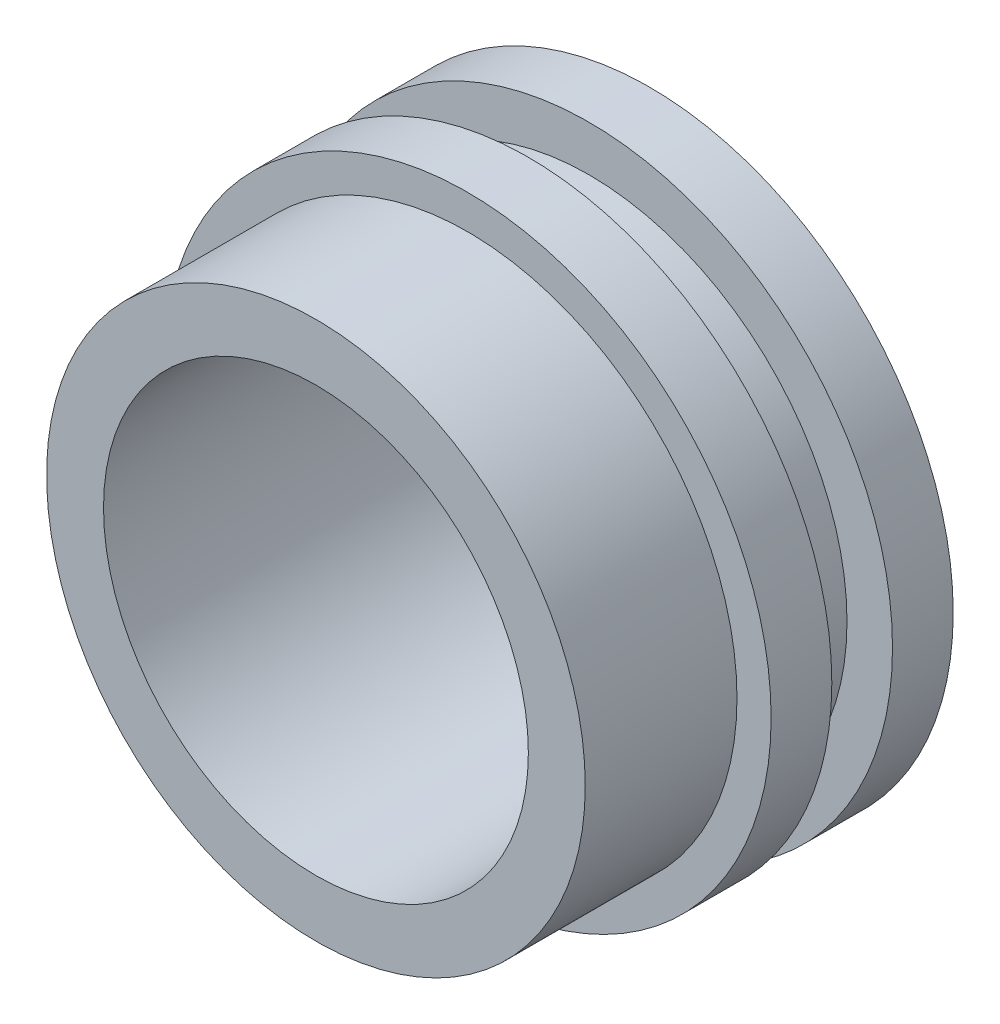
ISO-10303-21;
HEADER;
FILE_DESCRIPTION(('STEP AP214'),'2;1');
FILE_NAME('part.step','',(''),(''),'','','');
FILE_SCHEMA(('AUTOMOTIVE_DESIGN { 1 0 10303 214 1 1 1 1 }'));
ENDSEC;
DATA;
#1=APPLICATION_CONTEXT('core data for automotive mechanical design processes');
#2=APPLICATION_PROTOCOL_DEFINITION('international standard','automotive_design',2000,#1);
#3=PRODUCT_CONTEXT('',#1,'mechanical');
#4=PRODUCT('Part','Part','',(#3));
#5=PRODUCT_RELATED_PRODUCT_CATEGORY('part','',(#4));
#6=PRODUCT_DEFINITION_FORMATION('','',#4);
#7=PRODUCT_DEFINITION_CONTEXT('part definition',#1,'design');
#8=PRODUCT_DEFINITION('design','',#6,#7);
#9=PRODUCT_DEFINITION_SHAPE('','',#8);
#10=(LENGTH_UNIT() NAMED_UNIT(*) SI_UNIT(.MILLI.,.METRE.));
#11=(NAMED_UNIT(*) PLANE_ANGLE_UNIT() SI_UNIT($,.RADIAN.));
#12=(NAMED_UNIT(*) SI_UNIT($,.STERADIAN.) SOLID_ANGLE_UNIT());
#13=UNCERTAINTY_MEASURE_WITH_UNIT(LENGTH_MEASURE(1.E-05),#10,'distance_accuracy_value','');
#14=(GEOMETRIC_REPRESENTATION_CONTEXT(3) GLOBAL_UNCERTAINTY_ASSIGNED_CONTEXT((#13)) GLOBAL_UNIT_ASSIGNED_CONTEXT((#10,
#11,#12)) REPRESENTATION_CONTEXT('',''));
#15=CARTESIAN_POINT('',(0.,0.,0.));
#16=DIRECTION('',(0.,0.,1.));
#17=DIRECTION('',(1.,0.,0.));
#18=AXIS2_PLACEMENT_3D('',#15,#16,#17);
#19=CARTESIAN_POINT('',(0.,0.,6.));
#20=DIRECTION('',(0.,0.,1.));
#21=DIRECTION('',(1.,0.,0.));
#22=AXIS2_PLACEMENT_3D('',#19,#20,#21);
#23=PLANE('',#22);
#24=CARTESIAN_POINT('',(0.,0.,6.));
#25=DIRECTION('',(0.,0.,1.));
#26=DIRECTION('',(1.,0.,0.));
#27=AXIS2_PLACEMENT_3D('',#24,#25,#26);
#28=CIRCLE('',#27,10.);
#29=CARTESIAN_POINT('',(10.,0.,6.));
#30=VERTEX_POINT('',#29);
#31=EDGE_CURVE('E51',#30,#30,#28,.T.);
#32=ORIENTED_EDGE('',*,*,#31,.T.);
#33=EDGE_LOOP('',(#32));
#34=FACE_BOUND('',#33,.T.);
#35=CARTESIAN_POINT('',(0.,0.,6.));
#36=DIRECTION('',(0.,0.,1.));
#37=DIRECTION('',(1.,0.,0.));
#38=AXIS2_PLACEMENT_3D('',#35,#36,#37);
#39=CIRCLE('',#38,8.875);
#40=CARTESIAN_POINT('',(8.875,0.,6.));
#41=VERTEX_POINT('',#40);
#42=EDGE_CURVE('E61',#41,#41,#39,.T.);
#43=ORIENTED_EDGE('',*,*,#42,.F.);
#44=EDGE_LOOP('',(#43));
#45=FACE_BOUND('',#44,.T.);
#46=ADVANCED_FACE('F31',(#34,#45),#23,.T.);
#47=CARTESIAN_POINT('',(0.,0.,0.));
#48=DIRECTION('',(0.,0.,1.));
#49=DIRECTION('',(1.,0.,0.));
#50=AXIS2_PLACEMENT_3D('',#47,#48,#49);
#51=PLANE('',#50);
#52=CARTESIAN_POINT('',(0.,0.,0.));
#53=DIRECTION('',(0.,0.,1.));
#54=DIRECTION('',(1.,0.,0.));
#55=AXIS2_PLACEMENT_3D('',#52,#53,#54);
#56=CIRCLE('',#55,10.);
#57=CARTESIAN_POINT('',(10.,0.,0.));
#58=VERTEX_POINT('',#57);
#59=EDGE_CURVE('E42',#58,#58,#56,.T.);
#60=ORIENTED_EDGE('',*,*,#59,.F.);
#61=EDGE_LOOP('',(#60));
#62=FACE_BOUND('',#61,.T.);
#63=CARTESIAN_POINT('',(0.,0.,0.));
#64=DIRECTION('',(0.,0.,1.));
#65=DIRECTION('',(1.,0.,0.));
#66=AXIS2_PLACEMENT_3D('',#63,#64,#65);
#67=CIRCLE('',#66,7.);
#68=CARTESIAN_POINT('',(7.,0.,0.));
#69=VERTEX_POINT('',#68);
#70=EDGE_CURVE('E55',#69,#69,#67,.T.);
#71=ORIENTED_EDGE('',*,*,#70,.T.);
#72=EDGE_LOOP('',(#71));
#73=FACE_BOUND('',#72,.T.);
#74=ADVANCED_FACE('F87',(#62,#73),#51,.F.);
#75=CARTESIAN_POINT('',(0.,0.,6.));
#76=DIRECTION('',(0.,0.,-1.));
#77=DIRECTION('',(-1.,0.,0.));
#78=AXIS2_PLACEMENT_3D('',#75,#76,#77);
#79=CYLINDRICAL_SURFACE('',#78,8.5);
#80=CARTESIAN_POINT('',(0.,0.,2.));
#81=DIRECTION('',(0.,0.,1.));
#82=DIRECTION('',(1.,0.,0.));
#83=AXIS2_PLACEMENT_3D('',#80,#81,#82);
#84=CIRCLE('',#83,8.5);
#85=CARTESIAN_POINT('',(8.5,0.,2.));
#86=VERTEX_POINT('',#85);
#87=EDGE_CURVE('E47',#86,#86,#84,.F.);
#88=ORIENTED_EDGE('',*,*,#87,.F.);
#89=EDGE_LOOP('',(#88));
#90=FACE_BOUND('',#89,.T.);
#91=CARTESIAN_POINT('',(0.,0.,4.));
#92=DIRECTION('',(0.,0.,1.));
#93=DIRECTION('',(1.,0.,0.));
#94=AXIS2_PLACEMENT_3D('',#91,#92,#93);
#95=CIRCLE('',#94,8.5);
#96=CARTESIAN_POINT('',(8.5,0.,4.));
#97=VERTEX_POINT('',#96);
#98=EDGE_CURVE('E10',#97,#97,#95,.T.);
#99=ORIENTED_EDGE('',*,*,#98,.F.);
#100=EDGE_LOOP('',(#99));
#101=FACE_BOUND('',#100,.T.);
#102=ADVANCED_FACE('F93',(#90,#101),#79,.T.);
#103=CARTESIAN_POINT('',(0.,0.,2.));
#104=DIRECTION('',(0.,0.,1.));
#105=DIRECTION('',(1.,0.,0.));
#106=AXIS2_PLACEMENT_3D('',#103,#104,#105);
#107=PLANE('',#106);
#108=CARTESIAN_POINT('',(0.,0.,2.));
#109=DIRECTION('',(0.,0.,1.));
#110=DIRECTION('',(1.,0.,0.));
#111=AXIS2_PLACEMENT_3D('',#108,#109,#110);
#112=CIRCLE('',#111,10.);
#113=CARTESIAN_POINT('',(10.,0.,2.));
#114=VERTEX_POINT('',#113);
#115=EDGE_CURVE('E38',#114,#114,#112,.T.);
#116=ORIENTED_EDGE('',*,*,#115,.T.);
#117=EDGE_LOOP('',(#116));
#118=FACE_BOUND('',#117,.T.);
#119=ORIENTED_EDGE('',*,*,#87,.T.);
#120=EDGE_LOOP('',(#119));
#121=FACE_BOUND('',#120,.T.);
#122=ADVANCED_FACE('F101',(#118,#121),#107,.T.);
#123=CARTESIAN_POINT('',(0.,0.,2.));
#124=DIRECTION('',(0.,0.,-1.));
#125=DIRECTION('',(-1.,0.,0.));
#126=AXIS2_PLACEMENT_3D('',#123,#124,#125);
#127=CYLINDRICAL_SURFACE('',#126,10.);
#128=ORIENTED_EDGE('',*,*,#115,.F.);
#129=EDGE_LOOP('',(#128));
#130=FACE_BOUND('',#129,.T.);
#131=ORIENTED_EDGE('',*,*,#59,.T.);
#132=EDGE_LOOP('',(#131));
#133=FACE_BOUND('',#132,.T.);
#134=ADVANCED_FACE('F33',(#130,#133),#127,.T.);
#135=CARTESIAN_POINT('',(0.,0.,4.));
#136=DIRECTION('',(0.,0.,1.));
#137=DIRECTION('',(1.,0.,0.));
#138=AXIS2_PLACEMENT_3D('',#135,#136,#137);
#139=PLANE('',#138);
#140=CARTESIAN_POINT('',(0.,0.,4.));
#141=DIRECTION('',(0.,0.,1.));
#142=DIRECTION('',(1.,0.,0.));
#143=AXIS2_PLACEMENT_3D('',#140,#141,#142);
#144=CIRCLE('',#143,10.);
#145=CARTESIAN_POINT('',(10.,0.,4.));
#146=VERTEX_POINT('',#145);
#147=EDGE_CURVE('E52',#146,#146,#144,.T.);
#148=ORIENTED_EDGE('',*,*,#147,.F.);
#149=EDGE_LOOP('',(#148));
#150=FACE_BOUND('',#149,.T.);
#151=ORIENTED_EDGE('',*,*,#98,.T.);
#152=EDGE_LOOP('',(#151));
#153=FACE_BOUND('',#152,.T.);
#154=ADVANCED_FACE('F107',(#150,#153),#139,.F.);
#155=CARTESIAN_POINT('',(0.,0.,6.));
#156=DIRECTION('',(0.,0.,-1.));
#157=DIRECTION('',(-1.,0.,0.));
#158=AXIS2_PLACEMENT_3D('',#155,#156,#157);
#159=CYLINDRICAL_SURFACE('',#158,10.);
#160=ORIENTED_EDGE('',*,*,#31,.F.);
#161=EDGE_LOOP('',(#160));
#162=FACE_BOUND('',#161,.T.);
#163=ORIENTED_EDGE('',*,*,#147,.T.);
#164=EDGE_LOOP('',(#163));
#165=FACE_BOUND('',#164,.T.);
#166=ADVANCED_FACE('F83',(#162,#165),#159,.T.);
#167=CARTESIAN_POINT('',(0.,0.,6.));
#168=DIRECTION('',(0.,0.,-1.));
#169=DIRECTION('',(-1.,0.,0.));
#170=AXIS2_PLACEMENT_3D('',#167,#168,#169);
#171=CYLINDRICAL_SURFACE('',#170,7.);
#172=ORIENTED_EDGE('',*,*,#70,.F.);
#173=EDGE_LOOP('',(#172));
#174=FACE_BOUND('',#173,.T.);
#175=CARTESIAN_POINT('',(0.,0.,11.));
#176=DIRECTION('',(0.,0.,1.));
#177=DIRECTION('',(1.,0.,0.));
#178=AXIS2_PLACEMENT_3D('',#175,#176,#177);
#179=CIRCLE('',#178,7.);
#180=CARTESIAN_POINT('',(7.,0.,11.));
#181=VERTEX_POINT('',#180);
#182=EDGE_CURVE('E64',#181,#181,#179,.T.);
#183=ORIENTED_EDGE('',*,*,#182,.T.);
#184=EDGE_LOOP('',(#183));
#185=FACE_BOUND('',#184,.T.);
#186=ADVANCED_FACE('F70',(#174,#185),#171,.F.);
#187=CARTESIAN_POINT('',(0.,0.,11.));
#188=DIRECTION('',(0.,0.,1.));
#189=DIRECTION('',(1.,0.,0.));
#190=AXIS2_PLACEMENT_3D('',#187,#188,#189);
#191=PLANE('',#190);
#192=CARTESIAN_POINT('',(0.,0.,11.));
#193=DIRECTION('',(0.,0.,1.));
#194=DIRECTION('',(1.,0.,0.));
#195=AXIS2_PLACEMENT_3D('',#192,#193,#194);
#196=CIRCLE('',#195,8.875);
#197=CARTESIAN_POINT('',(8.875,0.,11.));
#198=VERTEX_POINT('',#197);
#199=EDGE_CURVE('E60',#198,#198,#196,.T.);
#200=ORIENTED_EDGE('',*,*,#199,.T.);
#201=EDGE_LOOP('',(#200));
#202=FACE_BOUND('',#201,.T.);
#203=ORIENTED_EDGE('',*,*,#182,.F.);
#204=EDGE_LOOP('',(#203));
#205=FACE_BOUND('',#204,.T.);
#206=ADVANCED_FACE('F72',(#202,#205),#191,.T.);
#207=CARTESIAN_POINT('',(0.,0.,11.));
#208=DIRECTION('',(0.,0.,-1.));
#209=DIRECTION('',(-1.,0.,0.));
#210=AXIS2_PLACEMENT_3D('',#207,#208,#209);
#211=CYLINDRICAL_SURFACE('',#210,8.875);
#212=ORIENTED_EDGE('',*,*,#199,.F.);
#213=EDGE_LOOP('',(#212));
#214=FACE_BOUND('',#213,.T.);
#215=ORIENTED_EDGE('',*,*,#42,.T.);
#216=EDGE_LOOP('',(#215));
#217=FACE_BOUND('',#216,.T.);
#218=ADVANCED_FACE('F74',(#214,#217),#211,.T.);
#219=CLOSED_SHELL('',(#46,#74,#102,#122,#134,#154,#166,#186,#206,#218));
#220=MANIFOLD_SOLID_BREP('B2',#219);
#221=ADVANCED_BREP_SHAPE_REPRESENTATION('',(#18,#220),#14);
#222=SHAPE_DEFINITION_REPRESENTATION(#9,#221);
ENDSEC;
END-ISO-10303-21;
